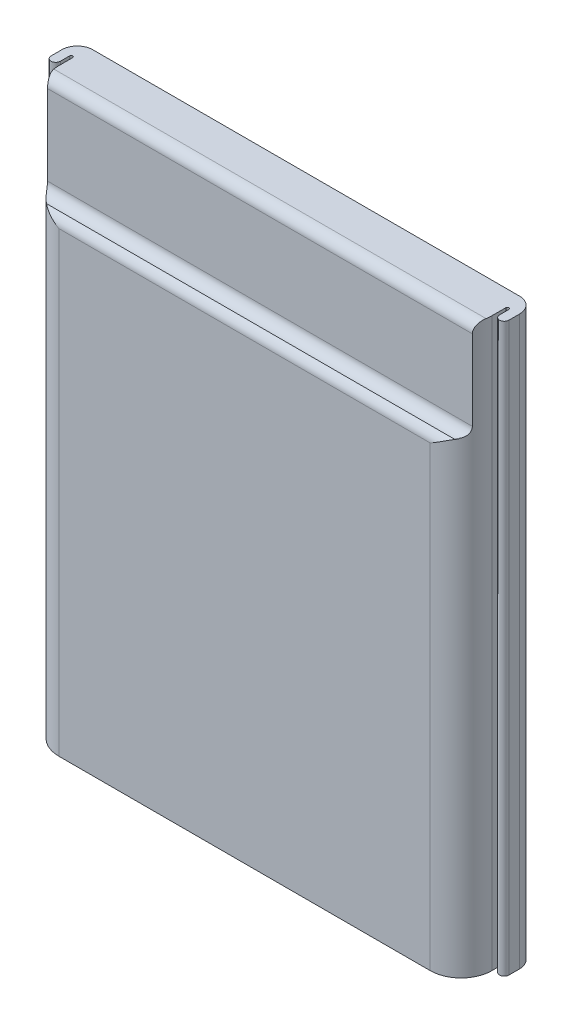
ISO-10303-21;
HEADER;
FILE_DESCRIPTION(('STEP AP214'),'2;1');
FILE_NAME('part.step','',(''),(''),'','','');
FILE_SCHEMA(('AUTOMOTIVE_DESIGN { 1 0 10303 214 1 1 1 1 }'));
ENDSEC;
DATA;
#1=APPLICATION_CONTEXT('core data for automotive mechanical design processes');
#2=APPLICATION_PROTOCOL_DEFINITION('international standard','automotive_design',2000,#1);
#3=PRODUCT_CONTEXT('',#1,'mechanical');
#4=PRODUCT('Part','Part','',(#3));
#5=PRODUCT_RELATED_PRODUCT_CATEGORY('part','',(#4));
#6=PRODUCT_DEFINITION_FORMATION('','',#4);
#7=PRODUCT_DEFINITION_CONTEXT('part definition',#1,'design');
#8=PRODUCT_DEFINITION('design','',#6,#7);
#9=PRODUCT_DEFINITION_SHAPE('','',#8);
#10=(LENGTH_UNIT() NAMED_UNIT(*) SI_UNIT(.MILLI.,.METRE.));
#11=(NAMED_UNIT(*) PLANE_ANGLE_UNIT() SI_UNIT($,.RADIAN.));
#12=(NAMED_UNIT(*) SI_UNIT($,.STERADIAN.) SOLID_ANGLE_UNIT());
#13=UNCERTAINTY_MEASURE_WITH_UNIT(LENGTH_MEASURE(1.E-05),#10,'distance_accuracy_value','');
#14=(GEOMETRIC_REPRESENTATION_CONTEXT(3) GLOBAL_UNCERTAINTY_ASSIGNED_CONTEXT((#13)) GLOBAL_UNIT_ASSIGNED_CONTEXT((#10,
#11,#12)) REPRESENTATION_CONTEXT('',''));
#15=CARTESIAN_POINT('',(0.,0.,0.));
#16=DIRECTION('',(0.,0.,1.));
#17=DIRECTION('',(1.,0.,0.));
#18=AXIS2_PLACEMENT_3D('',#15,#16,#17);
#19=CARTESIAN_POINT('',(-12.05,18.4,2.));
#20=DIRECTION('',(0.,-1.,0.));
#21=DIRECTION('',(0.,0.,-1.));
#22=AXIS2_PLACEMENT_3D('',#19,#20,#21);
#23=CYLINDRICAL_SURFACE('',#22,2.);
#24=CARTESIAN_POINT('',(-14.0191368667515,18.4,2.35));
#25=CARTESIAN_POINT('',(-14.0125609344921,18.4000258423735,2.38720826317085));
#26=CARTESIAN_POINT('',(-14.0048694097669,18.3968086891483,2.4241591284709));
#27=CARTESIAN_POINT('',(-13.9877434349587,18.3843318443298,2.49647410047727));
#28=CARTESIAN_POINT('',(-13.9783152990366,18.3750937449853,2.53184339647987));
#29=CARTESIAN_POINT('',(-13.9581646970334,18.3510290291053,2.6001553701829));
#30=CARTESIAN_POINT('',(-13.947444017274,18.3362100665892,2.6331012978363));
#31=CARTESIAN_POINT('',(-13.9253021283148,18.3014586581588,2.69595344895339));
#32=CARTESIAN_POINT('',(-13.9138802216746,18.2815210564394,2.72585656485584));
#33=CARTESIAN_POINT('',(-13.8904295818179,18.2358190182926,2.78347824411278));
#34=CARTESIAN_POINT('',(-13.8784008330899,18.2098013830623,2.8109964779475));
#35=CARTESIAN_POINT('',(-13.8552583856929,18.1531420891217,2.86128360696459));
#36=CARTESIAN_POINT('',(-13.8441449570182,18.1224990735485,2.88405110382572));
#37=CARTESIAN_POINT('',(-13.8238635520271,18.0572504672174,2.92407369196035));
#38=CARTESIAN_POINT('',(-13.8146935460875,18.0226490691685,2.9413345437444));
#39=CARTESIAN_POINT('',(-13.7993533551601,17.9503858909545,2.9695485909417));
#40=CARTESIAN_POINT('',(-13.7931754720044,17.9127322584751,2.98051798664042));
#41=CARTESIAN_POINT('',(-13.7866587392054,17.8538592489191,2.99198602933503));
#42=CARTESIAN_POINT('',(-13.7849402160426,17.8332492223571,2.99498291355548));
#43=CARTESIAN_POINT('',(-13.7826329344313,17.7917652075219,2.99899212215603));
#44=CARTESIAN_POINT('',(-13.7820447181195,17.7708910974135,3.00000349421653));
#45=CARTESIAN_POINT('',(-13.7820508075689,17.75,3.));
#46=B_SPLINE_CURVE_WITH_KNOTS('',3,(#24,#25,#26,#27,#28,#29,#30,#31,#32,#33,#34,#35,#36,#37,#38,
#39,#40,#41,#42,#43,#44,#45),.UNSPECIFIED.,.F.,.F.,(4,2,2,2,2,2,2,2,2,2,4),(0.,
0.113115292878996,0.225827148620393,0.338384982404669,0.45105663917476,0.569711468956826,
0.688401174223788,0.806966307735266,0.925224753327533,0.98780357331846,1.05041240092788),.UNSPECIFIED.);
#47=CARTESIAN_POINT('',(-14.0191368667515,18.4,2.35));
#48=VERTEX_POINT('',#47);
#49=CARTESIAN_POINT('',(-13.7820508075689,17.75,3.));
#50=VERTEX_POINT('',#49);
#51=EDGE_CURVE('E361',#48,#50,#46,.T.);
#52=ORIENTED_EDGE('',*,*,#51,.F.);
#53=CARTESIAN_POINT('',(-12.05,18.4,2.));
#54=DIRECTION('',(0.,1.,0.));
#55=DIRECTION('',(0.,0.,1.));
#56=AXIS2_PLACEMENT_3D('',#53,#54,#55);
#57=CIRCLE('',#56,2.);
#58=CARTESIAN_POINT('',(-14.05,18.4,2.));
#59=VERTEX_POINT('',#58);
#60=EDGE_CURVE('E276',#59,#48,#57,.T.);
#61=ORIENTED_EDGE('',*,*,#60,.F.);
#62=DIRECTION('',(0.,-1.,0.));
#63=VECTOR('',#62,1.);
#64=CARTESIAN_POINT('',(-14.05,18.4,2.));
#65=LINE('',#64,#63);
#66=CARTESIAN_POINT('',(-14.05,-18.4,2.));
#67=VERTEX_POINT('',#66);
#68=EDGE_CURVE('E239',#59,#67,#65,.T.);
#69=ORIENTED_EDGE('',*,*,#68,.T.);
#70=CARTESIAN_POINT('',(-12.05,-18.4,2.));
#71=DIRECTION('',(0.,1.,0.));
#72=DIRECTION('',(0.,0.,1.));
#73=AXIS2_PLACEMENT_3D('',#70,#71,#72);
#74=CIRCLE('',#73,2.);
#75=CARTESIAN_POINT('',(-12.05,-18.4,4.));
#76=VERTEX_POINT('',#75);
#77=EDGE_CURVE('E199',#67,#76,#74,.T.);
#78=ORIENTED_EDGE('',*,*,#77,.T.);
#79=DIRECTION('',(0.,-1.,0.));
#80=VECTOR('',#79,1.);
#81=CARTESIAN_POINT('',(-12.05,18.4,4.));
#82=LINE('',#81,#80);
#83=CARTESIAN_POINT('',(-12.05,11.25,4.));
#84=VERTEX_POINT('',#83);
#85=EDGE_CURVE('E237',#84,#76,#82,.T.);
#86=ORIENTED_EDGE('',*,*,#85,.F.);
#87=CARTESIAN_POINT('',(-13.5256354563374,11.9,3.35));
#88=CARTESIAN_POINT('',(-13.5026747888121,11.8999932469629,3.37510429602965));
#89=CARTESIAN_POINT('',(-13.479092967008,11.8985470125779,3.3995877556265));
#90=CARTESIAN_POINT('',(-13.4309067781462,11.8931451991544,3.44714747151514));
#91=CARTESIAN_POINT('',(-13.4063044500061,11.88919441785,3.4702263260433));
#92=CARTESIAN_POINT('',(-13.3316585836141,11.8742282759658,3.5368040701439));
#93=CARTESIAN_POINT('',(-13.2803126692842,11.8600840157248,3.57814755553335));
#94=CARTESIAN_POINT('',(-13.1508541290509,11.8177087843941,3.67247974823716));
#95=CARTESIAN_POINT('',(-13.0713753583094,11.7859868263596,3.72197198080511));
#96=CARTESIAN_POINT('',(-12.9089684463905,11.7141624891678,3.80851066967202));
#97=CARTESIAN_POINT('',(-12.8260211472614,11.674006663803,3.84547362186481));
#98=CARTESIAN_POINT('',(-12.6299445242252,11.5741623799291,3.91780631918262));
#99=CARTESIAN_POINT('',(-12.5160940623518,11.5124606757059,3.94841050017293));
#100=CARTESIAN_POINT('',(-12.2873647936436,11.3852882861596,3.98924690264115));
#101=CARTESIAN_POINT('',(-12.172490078954,11.3198294206419,3.99953975746523));
#102=CARTESIAN_POINT('',(-12.0551801140563,11.2529531167111,3.99999495627204));
#103=CARTESIAN_POINT('',(-12.0525900127255,11.2514765316063,3.99999998679931));
#104=CARTESIAN_POINT('',(-12.05,11.25,4.));
#105=B_SPLINE_CURVE_WITH_KNOTS('',3,(#87,#88,#89,#90,#91,#92,#93,#94,#95,#96,#97,#98,#99,#100,
#101,#102,#103,#104),.UNSPECIFIED.,.F.,.F.,(4,2,2,2,2,2,2,2,4),(0.,0.101961062793678,
0.203727395778662,0.405233373896115,0.700228855017803,0.997153423353591,1.39448612501564,
1.79063090440368,1.79957518905045),.UNSPECIFIED.);
#106=CARTESIAN_POINT('',(-13.5256354563374,11.9,3.35));
#107=VERTEX_POINT('',#106);
#108=EDGE_CURVE('E485',#107,#84,#105,.T.);
#109=ORIENTED_EDGE('',*,*,#108,.F.);
#110=CARTESIAN_POINT('',(-12.05,11.9,2.));
#111=DIRECTION('',(0.,1.,0.));
#112=DIRECTION('',(0.,0.,1.));
#113=AXIS2_PLACEMENT_3D('',#110,#111,#112);
#114=CIRCLE('',#113,2.);
#115=CARTESIAN_POINT('',(-13.1802654555457,11.9,3.65));
#116=VERTEX_POINT('',#115);
#117=EDGE_CURVE('E472',#116,#107,#114,.F.);
#118=ORIENTED_EDGE('',*,*,#117,.F.);
#119=CARTESIAN_POINT('',(-13.7820508075689,12.55,3.));
#120=CARTESIAN_POINT('',(-13.7820498862345,12.5176904752637,2.99995637373617));
#121=CARTESIAN_POINT('',(-13.7806613142877,12.485399718107,3.00240624212551));
#122=CARTESIAN_POINT('',(-13.7751040068922,12.4218433795202,3.01196361528386));
#123=CARTESIAN_POINT('',(-13.7709424539194,12.3905753679502,3.01905908635504));
#124=CARTESIAN_POINT('',(-13.7598341607176,12.3298746802876,3.0375818204953));
#125=CARTESIAN_POINT('',(-13.7528872890137,12.3004420909079,3.04900928804553));
#126=CARTESIAN_POINT('',(-13.7362185895538,12.2441707847135,3.07559922742473));
#127=CARTESIAN_POINT('',(-13.7264964139104,12.2173323936493,3.0907621674665));
#128=CARTESIAN_POINT('',(-13.7040908337591,12.166254680954,3.1244553599774));
#129=CARTESIAN_POINT('',(-13.6913451936879,12.1420882262506,3.14305426413868));
#130=CARTESIAN_POINT('',(-13.6631708077548,12.0974332858953,3.18248343636409));
#131=CARTESIAN_POINT('',(-13.6477412356223,12.0769459368455,3.20331439082274));
#132=CARTESIAN_POINT('',(-13.6128080647632,12.0379500609207,3.2484063439046));
#133=CARTESIAN_POINT('',(-13.5930546249908,12.019825351411,3.27280414969983));
#134=CARTESIAN_POINT('',(-13.5509547090799,11.9879429141754,3.3221924169791));
#135=CARTESIAN_POINT('',(-13.5286064335093,11.9741882419212,3.34718328005779));
#136=CARTESIAN_POINT('',(-13.468733882563,11.9441562289398,3.41067165885457));
#137=CARTESIAN_POINT('',(-13.4296402051282,11.9306749993229,3.44901278827458));
#138=CARTESIAN_POINT('',(-13.3473656726742,11.9113462944384,3.52313115070138));
#139=CARTESIAN_POINT('',(-13.3041776006627,11.9055125777892,3.55890365354961));
#140=CARTESIAN_POINT('',(-13.246506897889,11.9016483800652,3.60269737947491));
#141=CARTESIAN_POINT('',(-13.2333979060919,11.9010181349906,3.61240082170023));
#142=CARTESIAN_POINT('',(-13.2069855718748,11.9001947715259,3.63145570810274));
#143=CARTESIAN_POINT('',(-13.1936831134672,11.9000000660377,3.64080830778722));
#144=CARTESIAN_POINT('',(-13.1802654555457,11.9,3.65000000000001));
#145=B_SPLINE_CURVE_WITH_KNOTS('',3,(#119,#120,#121,#122,#123,#124,#125,#126,#127,#128,#129,
#130,#131,#132,#133,#134,#135,#136,#137,#138,#139,#140,#141,#142,#143,#144),.UNSPECIFIED.,.F.,
.F.,(4,2,2,2,2,2,2,2,2,2,2,2,4),(0.,0.0967772461247636,0.1933047926839,0.289836896153855,
0.386381105343504,0.485117841590142,0.583885028728736,0.692217796210262,0.800626142667602,
0.968854663512086,1.13738543030931,1.18634519502088,1.23512625858873),.UNSPECIFIED.);
#146=CARTESIAN_POINT('',(-13.7820508075689,12.55,3.));
#147=VERTEX_POINT('',#146);
#148=EDGE_CURVE('E467',#147,#116,#145,.T.);
#149=ORIENTED_EDGE('',*,*,#148,.F.);
#150=DIRECTION('',(0.,-1.,0.));
#151=VECTOR('',#150,1.);
#152=CARTESIAN_POINT('',(-13.7820508075689,18.4,3.));
#153=LINE('',#152,#151);
#154=EDGE_CURVE('E466',#50,#147,#153,.T.);
#155=ORIENTED_EDGE('',*,*,#154,.F.);
#156=EDGE_LOOP('',(#52,#61,#69,#78,#86,#109,#118,#149,#155));
#157=FACE_BOUND('',#156,.T.);
#158=ADVANCED_FACE('F35',(#157),#23,.T.);
#159=CARTESIAN_POINT('',(12.05,18.4,2.));
#160=DIRECTION('',(0.,-1.,0.));
#161=DIRECTION('',(0.,0.,-1.));
#162=AXIS2_PLACEMENT_3D('',#159,#160,#161);
#163=CYLINDRICAL_SURFACE('',#162,2.);
#164=CARTESIAN_POINT('',(14.0191368667515,18.4,2.35));
#165=CARTESIAN_POINT('',(14.0125609344921,18.4000258423735,2.38720826317085));
#166=CARTESIAN_POINT('',(14.0048694097669,18.3968086891483,2.4241591284709));
#167=CARTESIAN_POINT('',(13.9877434349587,18.3843318443298,2.49647410047727));
#168=CARTESIAN_POINT('',(13.9783152990366,18.3750937449853,2.53184339647987));
#169=CARTESIAN_POINT('',(13.9581646970334,18.3510290291053,2.6001553701829));
#170=CARTESIAN_POINT('',(13.947444017274,18.3362100665892,2.6331012978363));
#171=CARTESIAN_POINT('',(13.9253021283148,18.3014586581588,2.69595344895339));
#172=CARTESIAN_POINT('',(13.9138802216746,18.2815210564394,2.72585656485584));
#173=CARTESIAN_POINT('',(13.8904295818179,18.2358190182926,2.78347824411278));
#174=CARTESIAN_POINT('',(13.8784008330899,18.2098013830623,2.8109964779475));
#175=CARTESIAN_POINT('',(13.8552583856929,18.1531420891217,2.86128360696459));
#176=CARTESIAN_POINT('',(13.8441449570182,18.1224990735485,2.88405110382572));
#177=CARTESIAN_POINT('',(13.8238635520271,18.0572504672174,2.92407369196035));
#178=CARTESIAN_POINT('',(13.8146935460875,18.0226490691685,2.94133454374439));
#179=CARTESIAN_POINT('',(13.7993533551601,17.9503858909545,2.9695485909417));
#180=CARTESIAN_POINT('',(13.7931754720044,17.9127322584751,2.98051798664042));
#181=CARTESIAN_POINT('',(13.7866587392054,17.8538592489191,2.99198602933503));
#182=CARTESIAN_POINT('',(13.7849402160426,17.8332492223571,2.99498291355548));
#183=CARTESIAN_POINT('',(13.7826329344313,17.7917652075219,2.99899212215603));
#184=CARTESIAN_POINT('',(13.7820447181195,17.7708910974135,3.00000349421653));
#185=CARTESIAN_POINT('',(13.7820508075689,17.75,3.));
#186=B_SPLINE_CURVE_WITH_KNOTS('',3,(#164,#165,#166,#167,#168,#169,#170,#171,#172,#173,#174,
#175,#176,#177,#178,#179,#180,#181,#182,#183,#184,#185),.UNSPECIFIED.,.F.,.F.,(4,2,2,2,2,2,2,2,
2,2,4),(0.,0.113115292878996,0.225827148620393,0.338384982404669,0.45105663917476,
0.569711468956825,0.688401174223788,0.806966307735262,0.925224753327529,0.987803573318456,
1.05041240092788),.UNSPECIFIED.);
#187=CARTESIAN_POINT('',(14.0191368667515,18.4,2.35));
#188=VERTEX_POINT('',#187);
#189=CARTESIAN_POINT('',(13.7820508075689,17.75,3.));
#190=VERTEX_POINT('',#189);
#191=EDGE_CURVE('E50',#188,#190,#186,.T.);
#192=ORIENTED_EDGE('',*,*,#191,.T.);
#193=DIRECTION('',(0.,-1.,0.));
#194=VECTOR('',#193,1.);
#195=CARTESIAN_POINT('',(13.7820508075689,18.4,3.));
#196=LINE('',#195,#194);
#197=CARTESIAN_POINT('',(13.7820508075689,12.55,3.));
#198=VERTEX_POINT('',#197);
#199=EDGE_CURVE('E189',#190,#198,#196,.T.);
#200=ORIENTED_EDGE('',*,*,#199,.T.);
#201=CARTESIAN_POINT('',(13.7820508075689,12.55,3.));
#202=CARTESIAN_POINT('',(13.7820498862345,12.5176904752637,2.99995637373617));
#203=CARTESIAN_POINT('',(13.7806613142877,12.485399718107,3.00240624212551));
#204=CARTESIAN_POINT('',(13.7751040068922,12.4218433795202,3.01196361528386));
#205=CARTESIAN_POINT('',(13.7709424539193,12.3905753679502,3.01905908635504));
#206=CARTESIAN_POINT('',(13.7598341607176,12.3298746802876,3.0375818204953));
#207=CARTESIAN_POINT('',(13.7528872890137,12.3004420909079,3.04900928804553));
#208=CARTESIAN_POINT('',(13.7362185895538,12.2441707847135,3.07559922742473));
#209=CARTESIAN_POINT('',(13.7264964139104,12.2173323936493,3.0907621674665));
#210=CARTESIAN_POINT('',(13.7040908337591,12.166254680954,3.1244553599774));
#211=CARTESIAN_POINT('',(13.6913451936879,12.1420882262506,3.14305426413868));
#212=CARTESIAN_POINT('',(13.6631708077548,12.0974332858953,3.1824834363641));
#213=CARTESIAN_POINT('',(13.6477412356223,12.0769459368455,3.20331439082274));
#214=CARTESIAN_POINT('',(13.6128080647632,12.0379500609207,3.2484063439046));
#215=CARTESIAN_POINT('',(13.5930546249908,12.019825351411,3.27280414969983));
#216=CARTESIAN_POINT('',(13.5509547090799,11.9879429141754,3.3221924169791));
#217=CARTESIAN_POINT('',(13.5286064335093,11.9741882419212,3.34718328005779));
#218=CARTESIAN_POINT('',(13.468733882563,11.9441562289398,3.41067165885457));
#219=CARTESIAN_POINT('',(13.4296402051282,11.9306749993229,3.44901278827458));
#220=CARTESIAN_POINT('',(13.3473656726742,11.9113462944384,3.52313115070138));
#221=CARTESIAN_POINT('',(13.3041776006627,11.9055125777892,3.55890365354961));
#222=CARTESIAN_POINT('',(13.246506897889,11.9016483800652,3.60269737947491));
#223=CARTESIAN_POINT('',(13.2333979060919,11.9010181349906,3.61240082170023));
#224=CARTESIAN_POINT('',(13.2069855718748,11.9001947715259,3.63145570810274));
#225=CARTESIAN_POINT('',(13.1936831134672,11.9000000660377,3.64080830778722));
#226=CARTESIAN_POINT('',(13.1802654555457,11.9,3.65000000000001));
#227=B_SPLINE_CURVE_WITH_KNOTS('',3,(#201,#202,#203,#204,#205,#206,#207,#208,#209,#210,#211,
#212,#213,#214,#215,#216,#217,#218,#219,#220,#221,#222,#223,#224,#225,#226),.UNSPECIFIED.,.F.,
.F.,(4,2,2,2,2,2,2,2,2,2,2,2,4),(0.,0.0967772461247636,0.1933047926839,0.289836896153855,
0.386381105343504,0.485117841590144,0.583885028728737,0.692217796210261,0.800626142667603,
0.968854663512086,1.13738543030931,1.18634519502088,1.23512625858873),.UNSPECIFIED.);
#228=CARTESIAN_POINT('',(13.1802654555457,11.9,3.65));
#229=VERTEX_POINT('',#228);
#230=EDGE_CURVE('E353',#198,#229,#227,.T.);
#231=ORIENTED_EDGE('',*,*,#230,.T.);
#232=CARTESIAN_POINT('',(12.05,11.9,2.));
#233=DIRECTION('',(0.,-1.,0.));
#234=DIRECTION('',(0.,0.,-1.));
#235=AXIS2_PLACEMENT_3D('',#232,#233,#234);
#236=CIRCLE('',#235,2.);
#237=CARTESIAN_POINT('',(13.5256354563374,11.9,3.35));
#238=VERTEX_POINT('',#237);
#239=EDGE_CURVE('E360',#229,#238,#236,.F.);
#240=ORIENTED_EDGE('',*,*,#239,.T.);
#241=CARTESIAN_POINT('',(13.5256354563374,11.9,3.35));
#242=CARTESIAN_POINT('',(13.5026747888121,11.8999932469629,3.37510429602965));
#243=CARTESIAN_POINT('',(13.479092967008,11.8985470125779,3.39958775562648));
#244=CARTESIAN_POINT('',(13.4309067781463,11.8931451991544,3.44714747151512));
#245=CARTESIAN_POINT('',(13.4063044500062,11.88919441785,3.47022632604328));
#246=CARTESIAN_POINT('',(13.3316585836141,11.8742282759658,3.53680407014388));
#247=CARTESIAN_POINT('',(13.2803126692842,11.8600840157248,3.57814755553334));
#248=CARTESIAN_POINT('',(13.1508541290508,11.8177087843941,3.67247974823717));
#249=CARTESIAN_POINT('',(13.0713753583094,11.7859868263596,3.72197198080512));
#250=CARTESIAN_POINT('',(12.9089684463905,11.7141624891678,3.80851066967203));
#251=CARTESIAN_POINT('',(12.8260211472614,11.6740066638029,3.84547362186482));
#252=CARTESIAN_POINT('',(12.6299445242252,11.5741623799292,3.91780631918262));
#253=CARTESIAN_POINT('',(12.5160940623515,11.5124606757064,3.94841050017292));
#254=CARTESIAN_POINT('',(12.2873647936439,11.3852882861592,3.98924690264116));
#255=CARTESIAN_POINT('',(12.172490078955,11.3198294206401,3.99953975746524));
#256=CARTESIAN_POINT('',(12.0551801140564,11.252953116711,3.99999495627204));
#257=CARTESIAN_POINT('',(12.0525900127255,11.2514765316063,3.99999998679931));
#258=CARTESIAN_POINT('',(12.05,11.25,4.));
#259=B_SPLINE_CURVE_WITH_KNOTS('',3,(#241,#242,#243,#244,#245,#246,#247,#248,#249,#250,#251,
#252,#253,#254,#255,#256,#257,#258),.UNSPECIFIED.,.F.,.F.,(4,2,2,2,2,2,2,2,4),(0.,
0.101961062793655,0.203727395778614,0.405233373896117,0.700228855017837,0.997153423353588,
1.39448612501562,1.79063090440368,1.79957518905045),.UNSPECIFIED.);
#260=CARTESIAN_POINT('',(12.05,11.25,4.));
#261=VERTEX_POINT('',#260);
#262=EDGE_CURVE('E333',#238,#261,#259,.T.);
#263=ORIENTED_EDGE('',*,*,#262,.T.);
#264=DIRECTION('',(0.,-1.,0.));
#265=VECTOR('',#264,1.);
#266=CARTESIAN_POINT('',(12.05,18.4,4.));
#267=LINE('',#266,#265);
#268=CARTESIAN_POINT('',(12.05,-18.4,4.));
#269=VERTEX_POINT('',#268);
#270=EDGE_CURVE('E235',#261,#269,#267,.T.);
#271=ORIENTED_EDGE('',*,*,#270,.T.);
#272=CARTESIAN_POINT('',(12.05,-18.4,2.));
#273=DIRECTION('',(0.,1.,0.));
#274=DIRECTION('',(0.,0.,-1.));
#275=AXIS2_PLACEMENT_3D('',#272,#273,#274);
#276=CIRCLE('',#275,2.);
#277=CARTESIAN_POINT('',(14.05,-18.4,2.));
#278=VERTEX_POINT('',#277);
#279=EDGE_CURVE('E205',#269,#278,#276,.T.);
#280=ORIENTED_EDGE('',*,*,#279,.T.);
#281=DIRECTION('',(0.,-1.,0.));
#282=VECTOR('',#281,1.);
#283=CARTESIAN_POINT('',(14.05,18.4,2.));
#284=LINE('',#283,#282);
#285=CARTESIAN_POINT('',(14.05,18.4,2.));
#286=VERTEX_POINT('',#285);
#287=EDGE_CURVE('E232',#286,#278,#284,.T.);
#288=ORIENTED_EDGE('',*,*,#287,.F.);
#289=CARTESIAN_POINT('',(12.05,18.4,2.));
#290=DIRECTION('',(0.,1.,0.));
#291=DIRECTION('',(0.,0.,-1.));
#292=AXIS2_PLACEMENT_3D('',#289,#290,#291);
#293=CIRCLE('',#292,2.);
#294=EDGE_CURVE('E283',#188,#286,#293,.T.);
#295=ORIENTED_EDGE('',*,*,#294,.F.);
#296=EDGE_LOOP('',(#192,#200,#231,#240,#263,#271,#280,#288,#295));
#297=FACE_BOUND('',#296,.T.);
#298=ADVANCED_FACE('F384',(#297),#163,.T.);
#299=CARTESIAN_POINT('',(-13.85,18.4,1.));
#300=DIRECTION('',(0.,1.,0.));
#301=DIRECTION('',(0.,0.,1.));
#302=AXIS2_PLACEMENT_3D('',#299,#300,#301);
#303=PLANE('',#302);
#304=DIRECTION('',(-1.,0.,0.));
#305=VECTOR('',#304,1.);
#306=CARTESIAN_POINT('',(14.851,18.4,2.35));
#307=LINE('',#306,#305);
#308=EDGE_CURVE('E309',#188,#48,#307,.T.);
#309=ORIENTED_EDGE('',*,*,#308,.F.);
#310=ORIENTED_EDGE('',*,*,#294,.T.);
#311=DIRECTION('',(0.,0.,-1.));
#312=VECTOR('',#311,1.);
#313=CARTESIAN_POINT('',(14.05,18.4,1.1));
#314=LINE('',#313,#312);
#315=CARTESIAN_POINT('',(14.05,18.4,1.1));
#316=VERTEX_POINT('',#315);
#317=EDGE_CURVE('E285',#286,#316,#314,.T.);
#318=ORIENTED_EDGE('',*,*,#317,.T.);
#319=CARTESIAN_POINT('',(14.15,18.4,1.1));
#320=DIRECTION('',(0.,-1.,0.));
#321=DIRECTION('',(0.,0.,-1.));
#322=AXIS2_PLACEMENT_3D('',#319,#320,#321);
#323=CIRCLE('',#322,0.0999999999999977);
#324=CARTESIAN_POINT('',(14.25,18.4,1.1));
#325=VERTEX_POINT('',#324);
#326=EDGE_CURVE('E287',#316,#325,#323,.T.);
#327=ORIENTED_EDGE('',*,*,#326,.T.);
#328=DIRECTION('',(0.,0.,1.));
#329=VECTOR('',#328,1.);
#330=CARTESIAN_POINT('',(14.25,18.4,1.70000000000001));
#331=LINE('',#330,#329);
#332=CARTESIAN_POINT('',(14.25,18.4,1.70000000000001));
#333=VERTEX_POINT('',#332);
#334=EDGE_CURVE('E289',#325,#333,#331,.T.);
#335=ORIENTED_EDGE('',*,*,#334,.T.);
#336=CARTESIAN_POINT('',(14.55,18.4,1.70000000000001));
#337=DIRECTION('',(0.,1.,0.));
#338=DIRECTION('',(0.,0.,-1.));
#339=AXIS2_PLACEMENT_3D('',#336,#337,#338);
#340=CIRCLE('',#339,0.300000000000005);
#341=CARTESIAN_POINT('',(14.85,18.4,1.70000000000001));
#342=VERTEX_POINT('',#341);
#343=EDGE_CURVE('E164',#333,#342,#340,.T.);
#344=ORIENTED_EDGE('',*,*,#343,.T.);
#345=DIRECTION('',(0.,0.,-1.));
#346=VECTOR('',#345,1.);
#347=CARTESIAN_POINT('',(14.85,18.4,1.));
#348=LINE('',#347,#346);
#349=CARTESIAN_POINT('',(14.85,18.4,1.));
#350=VERTEX_POINT('',#349);
#351=EDGE_CURVE('E157',#342,#350,#348,.T.);
#352=ORIENTED_EDGE('',*,*,#351,.T.);
#353=CARTESIAN_POINT('',(13.85,18.4,1.));
#354=DIRECTION('',(0.,1.,0.));
#355=DIRECTION('',(0.,0.,-1.));
#356=AXIS2_PLACEMENT_3D('',#353,#354,#355);
#357=CIRCLE('',#356,1.);
#358=CARTESIAN_POINT('',(13.85,18.4,0.));
#359=VERTEX_POINT('',#358);
#360=EDGE_CURVE('E161',#350,#359,#357,.T.);
#361=ORIENTED_EDGE('',*,*,#360,.T.);
#362=DIRECTION('',(-1.,0.,0.));
#363=VECTOR('',#362,1.);
#364=CARTESIAN_POINT('',(-13.85,18.4,0.));
#365=LINE('',#364,#363);
#366=CARTESIAN_POINT('',(-13.85,18.4,0.));
#367=VERTEX_POINT('',#366);
#368=EDGE_CURVE('E59',#359,#367,#365,.T.);
#369=ORIENTED_EDGE('',*,*,#368,.T.);
#370=CARTESIAN_POINT('',(-13.85,18.4,1.));
#371=DIRECTION('',(0.,1.,0.));
#372=DIRECTION('',(0.,0.,1.));
#373=AXIS2_PLACEMENT_3D('',#370,#371,#372);
#374=CIRCLE('',#373,1.);
#375=CARTESIAN_POINT('',(-14.85,18.4,1.));
#376=VERTEX_POINT('',#375);
#377=EDGE_CURVE('E219',#367,#376,#374,.T.);
#378=ORIENTED_EDGE('',*,*,#377,.T.);
#379=DIRECTION('',(0.,0.,1.));
#380=VECTOR('',#379,1.);
#381=CARTESIAN_POINT('',(-14.85,18.4,1.));
#382=LINE('',#381,#380);
#383=CARTESIAN_POINT('',(-14.85,18.4,1.7));
#384=VERTEX_POINT('',#383);
#385=EDGE_CURVE('E124',#376,#384,#382,.T.);
#386=ORIENTED_EDGE('',*,*,#385,.T.);
#387=CARTESIAN_POINT('',(-14.55,18.4,1.7));
#388=DIRECTION('',(0.,1.,0.));
#389=DIRECTION('',(0.,0.,1.));
#390=AXIS2_PLACEMENT_3D('',#387,#388,#389);
#391=CIRCLE('',#390,0.300000000000002);
#392=CARTESIAN_POINT('',(-14.25,18.4,1.7));
#393=VERTEX_POINT('',#392);
#394=EDGE_CURVE('E256',#384,#393,#391,.T.);
#395=ORIENTED_EDGE('',*,*,#394,.T.);
#396=DIRECTION('',(0.,0.,-1.));
#397=VECTOR('',#396,1.);
#398=CARTESIAN_POINT('',(-14.25,18.4,1.7));
#399=LINE('',#398,#397);
#400=CARTESIAN_POINT('',(-14.25,18.4,1.1));
#401=VERTEX_POINT('',#400);
#402=EDGE_CURVE('E274',#393,#401,#399,.T.);
#403=ORIENTED_EDGE('',*,*,#402,.T.);
#404=CARTESIAN_POINT('',(-14.15,18.4,1.1));
#405=DIRECTION('',(0.,-1.,0.));
#406=DIRECTION('',(0.,0.,1.));
#407=AXIS2_PLACEMENT_3D('',#404,#405,#406);
#408=CIRCLE('',#407,0.0999999999999994);
#409=CARTESIAN_POINT('',(-14.05,18.4,1.1));
#410=VERTEX_POINT('',#409);
#411=EDGE_CURVE('E271',#401,#410,#408,.T.);
#412=ORIENTED_EDGE('',*,*,#411,.T.);
#413=DIRECTION('',(0.,0.,1.));
#414=VECTOR('',#413,1.);
#415=CARTESIAN_POINT('',(-14.05,18.4,2.));
#416=LINE('',#415,#414);
#417=EDGE_CURVE('E273',#410,#59,#416,.T.);
#418=ORIENTED_EDGE('',*,*,#417,.T.);
#419=ORIENTED_EDGE('',*,*,#60,.T.);
#420=EDGE_LOOP('',(#309,#310,#318,#327,#335,#344,#352,#361,#369,#378,#386,#395,#403,#412,#418,#419));
#421=FACE_BOUND('',#420,.T.);
#422=ADVANCED_FACE('F159',(#421),#303,.T.);
#423=CARTESIAN_POINT('',(-13.85,18.4,1.));
#424=DIRECTION('',(0.,-1.,0.));
#425=DIRECTION('',(0.,0.,-1.));
#426=AXIS2_PLACEMENT_3D('',#423,#424,#425);
#427=CYLINDRICAL_SURFACE('',#426,1.);
#428=CARTESIAN_POINT('',(-13.85,-18.4,1.));
#429=DIRECTION('',(0.,1.,0.));
#430=DIRECTION('',(0.,0.,1.));
#431=AXIS2_PLACEMENT_3D('',#428,#429,#430);
#432=CIRCLE('',#431,1.);
#433=CARTESIAN_POINT('',(-13.85,-18.4,0.));
#434=VERTEX_POINT('',#433);
#435=CARTESIAN_POINT('',(-14.85,-18.4,1.));
#436=VERTEX_POINT('',#435);
#437=EDGE_CURVE('E185',#434,#436,#432,.T.);
#438=ORIENTED_EDGE('',*,*,#437,.T.);
#439=DIRECTION('',(0.,-1.,0.));
#440=VECTOR('',#439,1.);
#441=CARTESIAN_POINT('',(-14.85,18.4,1.));
#442=LINE('',#441,#440);
#443=EDGE_CURVE('E11',#376,#436,#442,.T.);
#444=ORIENTED_EDGE('',*,*,#443,.F.);
#445=ORIENTED_EDGE('',*,*,#377,.F.);
#446=DIRECTION('',(0.,-1.,0.));
#447=VECTOR('',#446,1.);
#448=CARTESIAN_POINT('',(-13.85,18.4,0.));
#449=LINE('',#448,#447);
#450=EDGE_CURVE('E181',#367,#434,#449,.T.);
#451=ORIENTED_EDGE('',*,*,#450,.T.);
#452=EDGE_LOOP('',(#438,#444,#445,#451));
#453=FACE_BOUND('',#452,.T.);
#454=ADVANCED_FACE('F37',(#453),#427,.T.);
#455=CARTESIAN_POINT('',(-14.85,18.4,1.));
#456=DIRECTION('',(1.,0.,0.));
#457=DIRECTION('',(0.,0.,-1.));
#458=AXIS2_PLACEMENT_3D('',#455,#456,#457);
#459=PLANE('',#458);
#460=DIRECTION('',(0.,0.,1.));
#461=VECTOR('',#460,1.);
#462=CARTESIAN_POINT('',(-14.85,-18.4,1.));
#463=LINE('',#462,#461);
#464=CARTESIAN_POINT('',(-14.85,-18.4,1.7));
#465=VERTEX_POINT('',#464);
#466=EDGE_CURVE('E188',#436,#465,#463,.T.);
#467=ORIENTED_EDGE('',*,*,#466,.T.);
#468=DIRECTION('',(0.,-1.,0.));
#469=VECTOR('',#468,1.);
#470=CARTESIAN_POINT('',(-14.85,18.4,1.7));
#471=LINE('',#470,#469);
#472=EDGE_CURVE('E43',#384,#465,#471,.T.);
#473=ORIENTED_EDGE('',*,*,#472,.F.);
#474=ORIENTED_EDGE('',*,*,#385,.F.);
#475=ORIENTED_EDGE('',*,*,#443,.T.);
#476=EDGE_LOOP('',(#467,#473,#474,#475));
#477=FACE_BOUND('',#476,.T.);
#478=ADVANCED_FACE('F405',(#477),#459,.F.);
#479=CARTESIAN_POINT('',(-14.55,18.4,1.7));
#480=DIRECTION('',(0.,-1.,0.));
#481=DIRECTION('',(0.,0.,-1.));
#482=AXIS2_PLACEMENT_3D('',#479,#480,#481);
#483=CYLINDRICAL_SURFACE('',#482,0.300000000000002);
#484=CARTESIAN_POINT('',(-14.55,-18.4,1.7));
#485=DIRECTION('',(0.,1.,0.));
#486=DIRECTION('',(0.,0.,1.));
#487=AXIS2_PLACEMENT_3D('',#484,#485,#486);
#488=CIRCLE('',#487,0.300000000000002);
#489=CARTESIAN_POINT('',(-14.25,-18.4,1.7));
#490=VERTEX_POINT('',#489);
#491=EDGE_CURVE('E191',#465,#490,#488,.T.);
#492=ORIENTED_EDGE('',*,*,#491,.T.);
#493=DIRECTION('',(0.,-1.,0.));
#494=VECTOR('',#493,1.);
#495=CARTESIAN_POINT('',(-14.25,18.4,1.7));
#496=LINE('',#495,#494);
#497=EDGE_CURVE('E248',#393,#490,#496,.T.);
#498=ORIENTED_EDGE('',*,*,#497,.F.);
#499=ORIENTED_EDGE('',*,*,#394,.F.);
#500=ORIENTED_EDGE('',*,*,#472,.T.);
#501=EDGE_LOOP('',(#492,#498,#499,#500));
#502=FACE_BOUND('',#501,.T.);
#503=ADVANCED_FACE('F254',(#502),#483,.T.);
#504=CARTESIAN_POINT('',(-14.25,18.4,1.7));
#505=DIRECTION('',(-1.,0.,0.));
#506=DIRECTION('',(0.,0.,1.));
#507=AXIS2_PLACEMENT_3D('',#504,#505,#506);
#508=PLANE('',#507);
#509=DIRECTION('',(0.,0.,-1.));
#510=VECTOR('',#509,1.);
#511=CARTESIAN_POINT('',(-14.25,-18.4,1.7));
#512=LINE('',#511,#510);
#513=CARTESIAN_POINT('',(-14.25,-18.4,1.1));
#514=VERTEX_POINT('',#513);
#515=EDGE_CURVE('E193',#490,#514,#512,.T.);
#516=ORIENTED_EDGE('',*,*,#515,.T.);
#517=DIRECTION('',(0.,-1.,0.));
#518=VECTOR('',#517,1.);
#519=CARTESIAN_POINT('',(-14.25,18.4,1.1));
#520=LINE('',#519,#518);
#521=EDGE_CURVE('E245',#401,#514,#520,.T.);
#522=ORIENTED_EDGE('',*,*,#521,.F.);
#523=ORIENTED_EDGE('',*,*,#402,.F.);
#524=ORIENTED_EDGE('',*,*,#497,.T.);
#525=EDGE_LOOP('',(#516,#522,#523,#524));
#526=FACE_BOUND('',#525,.T.);
#527=ADVANCED_FACE('F265',(#526),#508,.F.);
#528=CARTESIAN_POINT('',(-14.15,18.4,1.1));
#529=DIRECTION('',(0.,-1.,0.));
#530=DIRECTION('',(0.,0.,-1.));
#531=AXIS2_PLACEMENT_3D('',#528,#529,#530);
#532=CYLINDRICAL_SURFACE('',#531,0.0999999999999994);
#533=CARTESIAN_POINT('',(-14.15,-18.4,1.1));
#534=DIRECTION('',(0.,-1.,0.));
#535=DIRECTION('',(0.,0.,1.));
#536=AXIS2_PLACEMENT_3D('',#533,#534,#535);
#537=CIRCLE('',#536,0.0999999999999994);
#538=CARTESIAN_POINT('',(-14.05,-18.4,1.1));
#539=VERTEX_POINT('',#538);
#540=EDGE_CURVE('E195',#514,#539,#537,.T.);
#541=ORIENTED_EDGE('',*,*,#540,.T.);
#542=DIRECTION('',(0.,-1.,0.));
#543=VECTOR('',#542,1.);
#544=CARTESIAN_POINT('',(-14.05,18.4,1.1));
#545=LINE('',#544,#543);
#546=EDGE_CURVE('E242',#410,#539,#545,.T.);
#547=ORIENTED_EDGE('',*,*,#546,.F.);
#548=ORIENTED_EDGE('',*,*,#411,.F.);
#549=ORIENTED_EDGE('',*,*,#521,.T.);
#550=EDGE_LOOP('',(#541,#547,#548,#549));
#551=FACE_BOUND('',#550,.T.);
#552=ADVANCED_FACE('F269',(#551),#532,.F.);
#553=CARTESIAN_POINT('',(-14.05,18.4,2.));
#554=DIRECTION('',(1.,0.,0.));
#555=DIRECTION('',(0.,0.,-1.));
#556=AXIS2_PLACEMENT_3D('',#553,#554,#555);
#557=PLANE('',#556);
#558=DIRECTION('',(0.,0.,1.));
#559=VECTOR('',#558,1.);
#560=CARTESIAN_POINT('',(-14.05,-18.4,2.));
#561=LINE('',#560,#559);
#562=EDGE_CURVE('E197',#539,#67,#561,.T.);
#563=ORIENTED_EDGE('',*,*,#562,.T.);
#564=ORIENTED_EDGE('',*,*,#68,.F.);
#565=ORIENTED_EDGE('',*,*,#417,.F.);
#566=ORIENTED_EDGE('',*,*,#546,.T.);
#567=EDGE_LOOP('',(#563,#564,#565,#566));
#568=FACE_BOUND('',#567,.T.);
#569=ADVANCED_FACE('F396',(#568),#557,.F.);
#570=CARTESIAN_POINT('',(-12.05,18.4,4.));
#571=DIRECTION('',(0.,0.,-1.));
#572=DIRECTION('',(-1.,0.,0.));
#573=AXIS2_PLACEMENT_3D('',#570,#571,#572);
#574=PLANE('',#573);
#575=ORIENTED_EDGE('',*,*,#270,.F.);
#576=DIRECTION('',(-1.,0.,0.));
#577=VECTOR('',#576,1.);
#578=CARTESIAN_POINT('',(14.851,11.25,4.));
#579=LINE('',#578,#577);
#580=EDGE_CURVE('E311',#261,#84,#579,.T.);
#581=ORIENTED_EDGE('',*,*,#580,.T.);
#582=ORIENTED_EDGE('',*,*,#85,.T.);
#583=DIRECTION('',(1.,0.,0.));
#584=VECTOR('',#583,1.);
#585=CARTESIAN_POINT('',(-12.05,-18.4,4.));
#586=LINE('',#585,#584);
#587=EDGE_CURVE('E202',#76,#269,#586,.T.);
#588=ORIENTED_EDGE('',*,*,#587,.T.);
#589=EDGE_LOOP('',(#575,#581,#582,#588));
#590=FACE_BOUND('',#589,.T.);
#591=ADVANCED_FACE('F395',(#590),#574,.F.);
#592=CARTESIAN_POINT('',(14.05,18.4,1.1));
#593=DIRECTION('',(-1.,0.,0.));
#594=DIRECTION('',(0.,0.,1.));
#595=AXIS2_PLACEMENT_3D('',#592,#593,#594);
#596=PLANE('',#595);
#597=DIRECTION('',(0.,0.,-1.));
#598=VECTOR('',#597,1.);
#599=CARTESIAN_POINT('',(14.05,-18.4,1.1));
#600=LINE('',#599,#598);
#601=CARTESIAN_POINT('',(14.05,-18.4,1.1));
#602=VERTEX_POINT('',#601);
#603=EDGE_CURVE('E207',#278,#602,#600,.T.);
#604=ORIENTED_EDGE('',*,*,#603,.T.);
#605=DIRECTION('',(0.,-1.,0.));
#606=VECTOR('',#605,1.);
#607=CARTESIAN_POINT('',(14.05,18.4,1.1));
#608=LINE('',#607,#606);
#609=EDGE_CURVE('E229',#316,#602,#608,.T.);
#610=ORIENTED_EDGE('',*,*,#609,.F.);
#611=ORIENTED_EDGE('',*,*,#317,.F.);
#612=ORIENTED_EDGE('',*,*,#287,.T.);
#613=EDGE_LOOP('',(#604,#610,#611,#612));
#614=FACE_BOUND('',#613,.T.);
#615=ADVANCED_FACE('F431',(#614),#596,.F.);
#616=CARTESIAN_POINT('',(14.15,18.4,1.1));
#617=DIRECTION('',(0.,-1.,0.));
#618=DIRECTION('',(0.,0.,-1.));
#619=AXIS2_PLACEMENT_3D('',#616,#617,#618);
#620=CYLINDRICAL_SURFACE('',#619,0.0999999999999977);
#621=CARTESIAN_POINT('',(14.15,-18.4,1.1));
#622=DIRECTION('',(0.,-1.,0.));
#623=DIRECTION('',(0.,0.,-1.));
#624=AXIS2_PLACEMENT_3D('',#621,#622,#623);
#625=CIRCLE('',#624,0.0999999999999977);
#626=CARTESIAN_POINT('',(14.25,-18.4,1.1));
#627=VERTEX_POINT('',#626);
#628=EDGE_CURVE('E209',#602,#627,#625,.T.);
#629=ORIENTED_EDGE('',*,*,#628,.T.);
#630=DIRECTION('',(0.,-1.,0.));
#631=VECTOR('',#630,1.);
#632=CARTESIAN_POINT('',(14.25,18.4,1.1));
#633=LINE('',#632,#631);
#634=EDGE_CURVE('E226',#325,#627,#633,.T.);
#635=ORIENTED_EDGE('',*,*,#634,.F.);
#636=ORIENTED_EDGE('',*,*,#326,.F.);
#637=ORIENTED_EDGE('',*,*,#609,.T.);
#638=EDGE_LOOP('',(#629,#635,#636,#637));
#639=FACE_BOUND('',#638,.T.);
#640=ADVANCED_FACE('F428',(#639),#620,.F.);
#641=CARTESIAN_POINT('',(14.25,18.4,1.70000000000001));
#642=DIRECTION('',(1.,0.,0.));
#643=DIRECTION('',(0.,0.,-1.));
#644=AXIS2_PLACEMENT_3D('',#641,#642,#643);
#645=PLANE('',#644);
#646=DIRECTION('',(0.,0.,1.));
#647=VECTOR('',#646,1.);
#648=CARTESIAN_POINT('',(14.25,-18.4,1.70000000000001));
#649=LINE('',#648,#647);
#650=CARTESIAN_POINT('',(14.25,-18.4,1.70000000000001));
#651=VERTEX_POINT('',#650);
#652=EDGE_CURVE('E211',#627,#651,#649,.T.);
#653=ORIENTED_EDGE('',*,*,#652,.T.);
#654=DIRECTION('',(0.,-1.,0.));
#655=VECTOR('',#654,1.);
#656=CARTESIAN_POINT('',(14.25,18.4,1.70000000000001));
#657=LINE('',#656,#655);
#658=EDGE_CURVE('E223',#333,#651,#657,.T.);
#659=ORIENTED_EDGE('',*,*,#658,.F.);
#660=ORIENTED_EDGE('',*,*,#334,.F.);
#661=ORIENTED_EDGE('',*,*,#634,.T.);
#662=EDGE_LOOP('',(#653,#659,#660,#661));
#663=FACE_BOUND('',#662,.T.);
#664=ADVANCED_FACE('F295',(#663),#645,.F.);
#665=CARTESIAN_POINT('',(14.55,18.4,1.70000000000001));
#666=DIRECTION('',(0.,-1.,0.));
#667=DIRECTION('',(0.,0.,-1.));
#668=AXIS2_PLACEMENT_3D('',#665,#666,#667);
#669=CYLINDRICAL_SURFACE('',#668,0.300000000000005);
#670=CARTESIAN_POINT('',(14.55,-18.4,1.70000000000001));
#671=DIRECTION('',(0.,1.,0.));
#672=DIRECTION('',(0.,0.,-1.));
#673=AXIS2_PLACEMENT_3D('',#670,#671,#672);
#674=CIRCLE('',#673,0.300000000000005);
#675=CARTESIAN_POINT('',(14.85,-18.4,1.70000000000001));
#676=VERTEX_POINT('',#675);
#677=EDGE_CURVE('E213',#651,#676,#674,.T.);
#678=ORIENTED_EDGE('',*,*,#677,.T.);
#679=DIRECTION('',(0.,-1.,0.));
#680=VECTOR('',#679,1.);
#681=CARTESIAN_POINT('',(14.85,18.4,1.70000000000001));
#682=LINE('',#681,#680);
#683=EDGE_CURVE('E176',#342,#676,#682,.T.);
#684=ORIENTED_EDGE('',*,*,#683,.F.);
#685=ORIENTED_EDGE('',*,*,#343,.F.);
#686=ORIENTED_EDGE('',*,*,#658,.T.);
#687=EDGE_LOOP('',(#678,#684,#685,#686));
#688=FACE_BOUND('',#687,.T.);
#689=ADVANCED_FACE('F299',(#688),#669,.T.);
#690=CARTESIAN_POINT('',(14.85,18.4,1.));
#691=DIRECTION('',(-1.,0.,0.));
#692=DIRECTION('',(0.,0.,1.));
#693=AXIS2_PLACEMENT_3D('',#690,#691,#692);
#694=PLANE('',#693);
#695=DIRECTION('',(0.,0.,-1.));
#696=VECTOR('',#695,1.);
#697=CARTESIAN_POINT('',(14.85,-18.4,1.));
#698=LINE('',#697,#696);
#699=CARTESIAN_POINT('',(14.85,-18.4,1.));
#700=VERTEX_POINT('',#699);
#701=EDGE_CURVE('E173',#676,#700,#698,.T.);
#702=ORIENTED_EDGE('',*,*,#701,.T.);
#703=DIRECTION('',(0.,-1.,0.));
#704=VECTOR('',#703,1.);
#705=CARTESIAN_POINT('',(14.85,18.4,1.));
#706=LINE('',#705,#704);
#707=EDGE_CURVE('E170',#350,#700,#706,.T.);
#708=ORIENTED_EDGE('',*,*,#707,.F.);
#709=ORIENTED_EDGE('',*,*,#351,.F.);
#710=ORIENTED_EDGE('',*,*,#683,.T.);
#711=EDGE_LOOP('',(#702,#708,#709,#710));
#712=FACE_BOUND('',#711,.T.);
#713=ADVANCED_FACE('F171',(#712),#694,.F.);
#714=CARTESIAN_POINT('',(13.85,18.4,1.));
#715=DIRECTION('',(0.,-1.,0.));
#716=DIRECTION('',(0.,0.,-1.));
#717=AXIS2_PLACEMENT_3D('',#714,#715,#716);
#718=CYLINDRICAL_SURFACE('',#717,1.);
#719=CARTESIAN_POINT('',(13.85,-18.4,1.));
#720=DIRECTION('',(0.,1.,0.));
#721=DIRECTION('',(0.,0.,-1.));
#722=AXIS2_PLACEMENT_3D('',#719,#720,#721);
#723=CIRCLE('',#722,1.);
#724=CARTESIAN_POINT('',(13.85,-18.4,0.));
#725=VERTEX_POINT('',#724);
#726=EDGE_CURVE('E216',#700,#725,#723,.T.);
#727=ORIENTED_EDGE('',*,*,#726,.T.);
#728=DIRECTION('',(0.,-1.,0.));
#729=VECTOR('',#728,1.);
#730=CARTESIAN_POINT('',(13.85,18.4,0.));
#731=LINE('',#730,#729);
#732=EDGE_CURVE('E177',#359,#725,#731,.T.);
#733=ORIENTED_EDGE('',*,*,#732,.F.);
#734=ORIENTED_EDGE('',*,*,#360,.F.);
#735=ORIENTED_EDGE('',*,*,#707,.T.);
#736=EDGE_LOOP('',(#727,#733,#734,#735));
#737=FACE_BOUND('',#736,.T.);
#738=ADVANCED_FACE('F179',(#737),#718,.T.);
#739=CARTESIAN_POINT('',(-13.85,18.4,0.));
#740=DIRECTION('',(0.,0.,1.));
#741=DIRECTION('',(1.,0.,0.));
#742=AXIS2_PLACEMENT_3D('',#739,#740,#741);
#743=PLANE('',#742);
#744=DIRECTION('',(-1.,0.,0.));
#745=VECTOR('',#744,1.);
#746=CARTESIAN_POINT('',(-13.85,-18.4,0.));
#747=LINE('',#746,#745);
#748=EDGE_CURVE('E116',#725,#434,#747,.T.);
#749=ORIENTED_EDGE('',*,*,#748,.T.);
#750=ORIENTED_EDGE('',*,*,#450,.F.);
#751=ORIENTED_EDGE('',*,*,#368,.F.);
#752=ORIENTED_EDGE('',*,*,#732,.T.);
#753=EDGE_LOOP('',(#749,#750,#751,#752));
#754=FACE_BOUND('',#753,.T.);
#755=ADVANCED_FACE('F300',(#754),#743,.F.);
#756=CARTESIAN_POINT('',(-13.85,-18.4,1.));
#757=DIRECTION('',(0.,1.,0.));
#758=DIRECTION('',(0.,0.,1.));
#759=AXIS2_PLACEMENT_3D('',#756,#757,#758);
#760=PLANE('',#759);
#761=ORIENTED_EDGE('',*,*,#437,.F.);
#762=ORIENTED_EDGE('',*,*,#748,.F.);
#763=ORIENTED_EDGE('',*,*,#726,.F.);
#764=ORIENTED_EDGE('',*,*,#701,.F.);
#765=ORIENTED_EDGE('',*,*,#677,.F.);
#766=ORIENTED_EDGE('',*,*,#652,.F.);
#767=ORIENTED_EDGE('',*,*,#628,.F.);
#768=ORIENTED_EDGE('',*,*,#603,.F.);
#769=ORIENTED_EDGE('',*,*,#279,.F.);
#770=ORIENTED_EDGE('',*,*,#587,.F.);
#771=ORIENTED_EDGE('',*,*,#77,.F.);
#772=ORIENTED_EDGE('',*,*,#562,.F.);
#773=ORIENTED_EDGE('',*,*,#540,.F.);
#774=ORIENTED_EDGE('',*,*,#515,.F.);
#775=ORIENTED_EDGE('',*,*,#491,.F.);
#776=ORIENTED_EDGE('',*,*,#466,.F.);
#777=EDGE_LOOP('',(#761,#762,#763,#764,#765,#766,#767,#768,#769,#770,#771,#772,#773,#774,#775,#776));
#778=FACE_BOUND('',#777,.T.);
#779=ADVANCED_FACE('F260',(#778),#760,.F.);
#780=CARTESIAN_POINT('',(14.851,17.75,2.35));
#781=DIRECTION('',(-1.,0.,0.));
#782=DIRECTION('',(0.,0.,1.));
#783=AXIS2_PLACEMENT_3D('',#780,#781,#782);
#784=CYLINDRICAL_SURFACE('',#783,0.650000000000001);
#785=ORIENTED_EDGE('',*,*,#308,.T.);
#786=ORIENTED_EDGE('',*,*,#51,.T.);
#787=DIRECTION('',(-1.,0.,0.));
#788=VECTOR('',#787,1.);
#789=CARTESIAN_POINT('',(14.851,17.75,3.));
#790=LINE('',#789,#788);
#791=EDGE_CURVE('E323',#190,#50,#790,.T.);
#792=ORIENTED_EDGE('',*,*,#791,.F.);
#793=ORIENTED_EDGE('',*,*,#191,.F.);
#794=EDGE_LOOP('',(#785,#786,#792,#793));
#795=FACE_BOUND('',#794,.T.);
#796=ADVANCED_FACE('F340',(#795),#784,.T.);
#797=CARTESIAN_POINT('',(14.851,11.25,3.35));
#798=DIRECTION('',(-1.,0.,0.));
#799=DIRECTION('',(0.,0.,1.));
#800=AXIS2_PLACEMENT_3D('',#797,#798,#799);
#801=CYLINDRICAL_SURFACE('',#800,0.649999999999999);
#802=DIRECTION('',(-1.,0.,0.));
#803=VECTOR('',#802,1.);
#804=CARTESIAN_POINT('',(14.851,11.9,3.35));
#805=LINE('',#804,#803);
#806=EDGE_CURVE('E314',#238,#107,#805,.T.);
#807=ORIENTED_EDGE('',*,*,#806,.T.);
#808=ORIENTED_EDGE('',*,*,#108,.T.);
#809=ORIENTED_EDGE('',*,*,#580,.F.);
#810=ORIENTED_EDGE('',*,*,#262,.F.);
#811=EDGE_LOOP('',(#807,#808,#809,#810));
#812=FACE_BOUND('',#811,.T.);
#813=ADVANCED_FACE('F375',(#812),#801,.T.);
#814=CARTESIAN_POINT('',(14.851,11.9,3.65));
#815=DIRECTION('',(0.,-1.,0.));
#816=DIRECTION('',(0.,0.,-1.));
#817=AXIS2_PLACEMENT_3D('',#814,#815,#816);
#818=PLANE('',#817);
#819=DIRECTION('',(-1.,0.,0.));
#820=VECTOR('',#819,1.);
#821=CARTESIAN_POINT('',(14.851,11.9,3.65));
#822=LINE('',#821,#820);
#823=EDGE_CURVE('E317',#229,#116,#822,.T.);
#824=ORIENTED_EDGE('',*,*,#823,.T.);
#825=ORIENTED_EDGE('',*,*,#117,.T.);
#826=ORIENTED_EDGE('',*,*,#806,.F.);
#827=ORIENTED_EDGE('',*,*,#239,.F.);
#828=EDGE_LOOP('',(#824,#825,#826,#827));
#829=FACE_BOUND('',#828,.T.);
#830=ADVANCED_FACE('F372',(#829),#818,.T.);
#831=CARTESIAN_POINT('',(14.851,12.55,3.65));
#832=DIRECTION('',(-1.,0.,0.));
#833=DIRECTION('',(0.,0.,1.));
#834=AXIS2_PLACEMENT_3D('',#831,#832,#833);
#835=CYLINDRICAL_SURFACE('',#834,0.65);
#836=DIRECTION('',(-1.,0.,0.));
#837=VECTOR('',#836,1.);
#838=CARTESIAN_POINT('',(14.851,12.55,3.));
#839=LINE('',#838,#837);
#840=EDGE_CURVE('E320',#198,#147,#839,.T.);
#841=ORIENTED_EDGE('',*,*,#840,.T.);
#842=ORIENTED_EDGE('',*,*,#148,.T.);
#843=ORIENTED_EDGE('',*,*,#823,.F.);
#844=ORIENTED_EDGE('',*,*,#230,.F.);
#845=EDGE_LOOP('',(#841,#842,#843,#844));
#846=FACE_BOUND('',#845,.T.);
#847=ADVANCED_FACE('F368',(#846),#835,.F.);
#848=CARTESIAN_POINT('',(14.851,17.75,3.));
#849=DIRECTION('',(0.,0.,1.));
#850=DIRECTION('',(0.,-1.,0.));
#851=AXIS2_PLACEMENT_3D('',#848,#849,#850);
#852=PLANE('',#851);
#853=ORIENTED_EDGE('',*,*,#791,.T.);
#854=ORIENTED_EDGE('',*,*,#154,.T.);
#855=ORIENTED_EDGE('',*,*,#840,.F.);
#856=ORIENTED_EDGE('',*,*,#199,.F.);
#857=EDGE_LOOP('',(#853,#854,#855,#856));
#858=FACE_BOUND('',#857,.T.);
#859=ADVANCED_FACE('F348',(#858),#852,.T.);
#860=CLOSED_SHELL('',(#158,#298,#422,#454,#478,#503,#527,#552,#569,#591,#615,#640,#664,#689,
#713,#738,#755,#779,#796,#813,#830,#847,#859));
#861=MANIFOLD_SOLID_BREP('B2',#860);
#862=ADVANCED_BREP_SHAPE_REPRESENTATION('',(#18,#861),#14);
#863=SHAPE_DEFINITION_REPRESENTATION(#9,#862);
ENDSEC;
END-ISO-10303-21;
